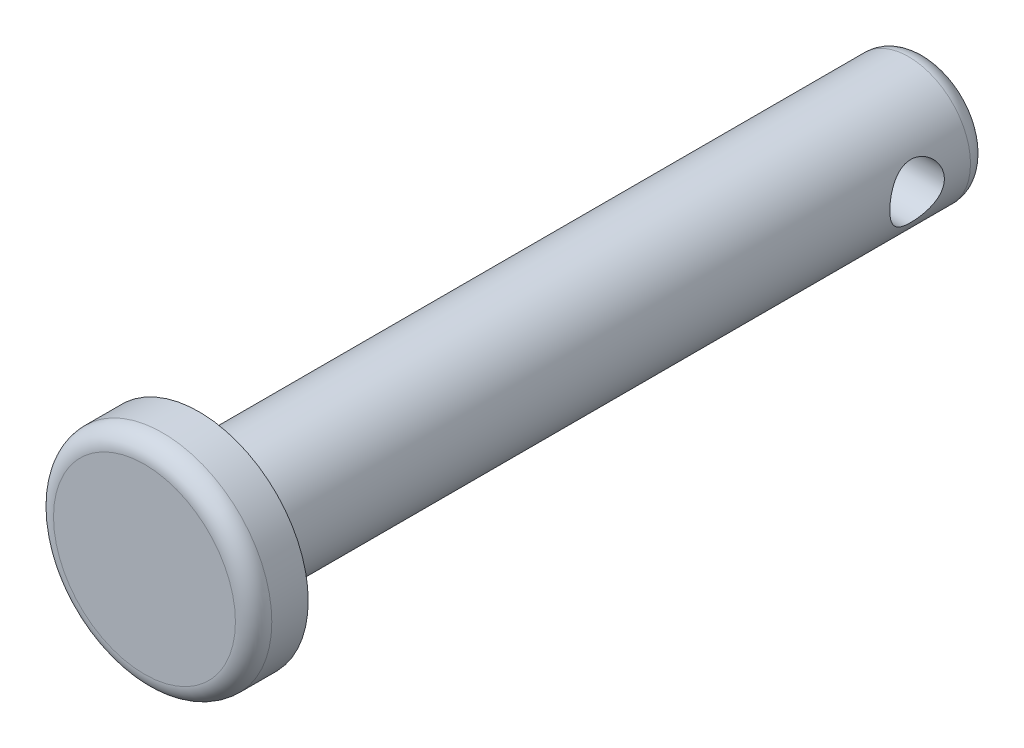
ISO-10303-21;
HEADER;
FILE_DESCRIPTION(('STEP AP214'),'2;1');
FILE_NAME('part.step','',(''),(''),'','','');
FILE_SCHEMA(('AUTOMOTIVE_DESIGN { 1 0 10303 214 1 1 1 1 }'));
ENDSEC;
DATA;
#1=APPLICATION_CONTEXT('core data for automotive mechanical design processes');
#2=APPLICATION_PROTOCOL_DEFINITION('international standard','automotive_design',2000,#1);
#3=PRODUCT_CONTEXT('',#1,'mechanical');
#4=PRODUCT('Part','Part','',(#3));
#5=PRODUCT_RELATED_PRODUCT_CATEGORY('part','',(#4));
#6=PRODUCT_DEFINITION_FORMATION('','',#4);
#7=PRODUCT_DEFINITION_CONTEXT('part definition',#1,'design');
#8=PRODUCT_DEFINITION('design','',#6,#7);
#9=PRODUCT_DEFINITION_SHAPE('','',#8);
#10=(LENGTH_UNIT() NAMED_UNIT(*) SI_UNIT(.MILLI.,.METRE.));
#11=(NAMED_UNIT(*) PLANE_ANGLE_UNIT() SI_UNIT($,.RADIAN.));
#12=(NAMED_UNIT(*) SI_UNIT($,.STERADIAN.) SOLID_ANGLE_UNIT());
#13=UNCERTAINTY_MEASURE_WITH_UNIT(LENGTH_MEASURE(1.E-05),#10,'distance_accuracy_value','');
#14=(GEOMETRIC_REPRESENTATION_CONTEXT(3) GLOBAL_UNCERTAINTY_ASSIGNED_CONTEXT((#13)) GLOBAL_UNIT_ASSIGNED_CONTEXT((#10,
#11,#12)) REPRESENTATION_CONTEXT('',''));
#15=CARTESIAN_POINT('',(0.,0.,0.));
#16=DIRECTION('',(0.,0.,1.));
#17=DIRECTION('',(1.,0.,0.));
#18=AXIS2_PLACEMENT_3D('',#15,#16,#17);
#19=CARTESIAN_POINT('',(0.,-8.76232133936268,221.521063329973));
#20=DIRECTION('',(0.,0.,1.));
#21=DIRECTION('',(1.,0.,0.));
#22=AXIS2_PLACEMENT_3D('',#19,#20,#21);
#23=CYLINDRICAL_SURFACE('',#22,17.);
#24=CARTESIAN_POINT('',(0.,-8.76232133936268,5.));
#25=DIRECTION('',(0.,0.,1.));
#26=DIRECTION('',(1.,0.,0.));
#27=AXIS2_PLACEMENT_3D('',#24,#25,#26);
#28=CIRCLE('',#27,17.);
#29=CARTESIAN_POINT('',(17.,-8.76232133936268,5.));
#30=VERTEX_POINT('',#29);
#31=EDGE_CURVE('E103',#30,#30,#28,.T.);
#32=ORIENTED_EDGE('',*,*,#31,.T.);
#33=EDGE_LOOP('',(#32));
#34=FACE_BOUND('',#33,.T.);
#35=CARTESIAN_POINT('',(0.,-8.76232133936268,200.028448312115));
#36=DIRECTION('',(0.,0.,1.));
#37=DIRECTION('',(1.,0.,0.));
#38=AXIS2_PLACEMENT_3D('',#35,#36,#37);
#39=CIRCLE('',#38,17.);
#40=CARTESIAN_POINT('',(17.,-8.76232133936268,200.028448312115));
#41=VERTEX_POINT('',#40);
#42=EDGE_CURVE('E107',#41,#41,#39,.T.);
#43=ORIENTED_EDGE('',*,*,#42,.F.);
#44=EDGE_LOOP('',(#43));
#45=FACE_BOUND('',#44,.T.);
#46=CARTESIAN_POINT('',(-17.,-8.76232133936268,27.1796390903297));
#47=CARTESIAN_POINT('',(-16.9999987618176,-8.56240971185686,27.17963760163));
#48=CARTESIAN_POINT('',(-16.9964643789322,-8.36244513842263,27.1716356781542));
#49=CARTESIAN_POINT('',(-16.9824145188103,-7.96395345314056,27.1397062777982));
#50=CARTESIAN_POINT('',(-16.9718950017991,-7.76542724035755,27.1157695852013));
#51=CARTESIAN_POINT('',(-16.9441250264791,-7.37099734679829,27.0521687131526));
#52=CARTESIAN_POINT('',(-16.9268618313529,-7.17509935844977,27.0124747705945));
#53=CARTESIAN_POINT('',(-16.8860473352039,-6.78763741091672,26.9177617280324));
#54=CARTESIAN_POINT('',(-16.8624934619151,-6.59607525949732,26.8627363585903));
#55=CARTESIAN_POINT('',(-16.8098052723294,-6.21939567596309,26.7381604841382));
#56=CARTESIAN_POINT('',(-16.7806936200709,-6.03425555943138,26.6686688703298));
#57=CARTESIAN_POINT('',(-16.7175308045529,-5.67068262419657,26.5156243049245));
#58=CARTESIAN_POINT('',(-16.6834777673438,-5.4922523825872,26.4320660168087));
#59=CARTESIAN_POINT('',(-16.611268748552,-5.14327899743994,26.2516313085886));
#60=CARTESIAN_POINT('',(-16.5731155536705,-4.97273060827862,26.1547639217918));
#61=CARTESIAN_POINT('',(-16.4935681939628,-4.64024815094122,25.9483588143517));
#62=CARTESIAN_POINT('',(-16.4521728517525,-4.47831724838952,25.8388164838507));
#63=CARTESIAN_POINT('',(-16.3202714333501,-3.99101600981834,25.4806955923257));
#64=CARTESIAN_POINT('',(-16.2257661736083,-3.68149653224687,25.2115636764044));
#65=CARTESIAN_POINT('',(-16.0357679165863,-3.11032645656515,24.626578069341));
#66=CARTESIAN_POINT('',(-15.9402743736387,-2.84870397774108,24.3106971283783));
#67=CARTESIAN_POINT('',(-15.8011827072377,-2.49013191163965,23.7974792469885));
#68=CARTESIAN_POINT('',(-15.7543279859237,-2.37366377003149,23.6143917119547));
#69=CARTESIAN_POINT('',(-15.6645887437617,-2.15668510158295,23.2381053026065));
#70=CARTESIAN_POINT('',(-15.6217025880908,-2.05616799151777,23.0449106436541));
#71=CARTESIAN_POINT('',(-15.5413433492321,-1.87198367209178,22.6496206554566));
#72=CARTESIAN_POINT('',(-15.5038690808926,-1.78831277198492,22.4475272876319));
#73=CARTESIAN_POINT('',(-15.4356802742711,-1.6386603936192,22.0357839044027));
#74=CARTESIAN_POINT('',(-15.4049651637826,-1.5726774178597,21.8261345304131));
#75=CARTESIAN_POINT('',(-15.3528822796065,-1.46214707756638,21.4119707862638));
#76=CARTESIAN_POINT('',(-15.3311111260477,-1.4166625980648,21.2077572966846));
#77=CARTESIAN_POINT('',(-15.2955268820101,-1.34285074403194,20.7955624254887));
#78=CARTESIAN_POINT('',(-15.2817135197181,-1.31452278348631,20.5875811728172));
#79=CARTESIAN_POINT('',(-15.2625890145722,-1.27540922878069,20.1697017725389));
#80=CARTESIAN_POINT('',(-15.2572731108275,-1.26461381156786,19.9598047646243));
#81=CARTESIAN_POINT('',(-15.2553422289413,-1.26068537674338,19.5398117838358));
#82=CARTESIAN_POINT('',(-15.2587267046698,-1.26755125051798,19.3297158242778));
#83=CARTESIAN_POINT('',(-15.2733790697403,-1.29746168233491,18.9296448804354));
#84=CARTESIAN_POINT('',(-15.2839249540816,-1.31902513243039,18.7395303310452));
#85=CARTESIAN_POINT('',(-15.3117899210469,-1.37651672080936,18.3619239613869));
#86=CARTESIAN_POINT('',(-15.3291113075622,-1.41244974530892,18.1744330557281));
#87=CARTESIAN_POINT('',(-15.3699767227151,-1.4982956396838,17.8034244341498));
#88=CARTESIAN_POINT('',(-15.3935194224016,-1.54820552406123,17.6199058787333));
#89=CARTESIAN_POINT('',(-15.4461324810744,-1.66155432330572,17.2578402500154));
#90=CARTESIAN_POINT('',(-15.4752049820337,-1.724998481846,17.0792951340057));
#91=CARTESIAN_POINT('',(-15.5387390782028,-1.86640062342164,16.7243786022578));
#92=CARTESIAN_POINT('',(-15.573304812122,-1.94464620471309,16.5481405707748));
#93=CARTESIAN_POINT('',(-15.6464005456784,-2.11411375606671,16.2028093316311));
#94=CARTESIAN_POINT('',(-15.684931877199,-2.20534008979867,16.0337185515176));
#95=CARTESIAN_POINT('',(-15.764957498936,-2.40015175661188,15.7035164796271));
#96=CARTESIAN_POINT('',(-15.8064522678598,-2.50373908828448,15.5424064842009));
#97=CARTESIAN_POINT('',(-15.89138829894,-2.72265560940581,15.2289093888122));
#98=CARTESIAN_POINT('',(-15.9348296834633,-2.83798553759203,15.076522838593));
#99=CARTESIAN_POINT('',(-16.0268726359395,-3.0914108516607,14.7669474822368));
#100=CARTESIAN_POINT('',(-16.0755689456753,-3.23062889467886,14.6107042057509));
#101=CARTESIAN_POINT('',(-16.1727699246668,-3.52161200415448,14.3104055582501));
#102=CARTESIAN_POINT('',(-16.2212746435545,-3.67337356261289,14.1663468022855));
#103=CARTESIAN_POINT('',(-16.3168738060765,-3.98876966087105,13.8911127410465));
#104=CARTESIAN_POINT('',(-16.363967292585,-4.15241201201704,13.7599460478464));
#105=CARTESIAN_POINT('',(-16.455469596727,-4.49053250272015,13.5115102557568));
#106=CARTESIAN_POINT('',(-16.4998794813852,-4.66500627891141,13.3942356152096));
#107=CARTESIAN_POINT('',(-16.5861192990811,-5.02913748178794,13.1711641724269));
#108=CARTESIAN_POINT('',(-16.6278356203005,-5.21908990371099,13.0658039738806));
#109=CARTESIAN_POINT('',(-16.7060159703569,-5.60821463610925,12.8716389423435));
#110=CARTESIAN_POINT('',(-16.7424822957187,-5.80738286459073,12.7828268656148));
#111=CARTESIAN_POINT('',(-16.8091112908856,-6.21357306024606,12.6226191484089));
#112=CARTESIAN_POINT('',(-16.8392756404038,-6.42059291723992,12.5512188661841));
#113=CARTESIAN_POINT('',(-16.8923989787866,-6.84093735525013,12.426617362648));
#114=CARTESIAN_POINT('',(-16.9153585910428,-7.05426138904755,12.3734145667592));
#115=CARTESIAN_POINT('',(-16.9520446758353,-7.47051154066575,12.2888907214171));
#116=CARTESIAN_POINT('',(-16.9663000182061,-7.67313603522841,12.2563105073376));
#117=CARTESIAN_POINT('',(-16.9875571747029,-8.08074925625464,12.2078537672064));
#118=CARTESIAN_POINT('',(-16.9945593219088,-8.28573787371624,12.1919764741258));
#119=CARTESIAN_POINT('',(-17.001112071305,-8.69638611542681,12.1771158012803));
#120=CARTESIAN_POINT('',(-17.0006648021213,-8.90204553120625,12.1781275955604));
#121=CARTESIAN_POINT('',(-16.9923363399864,-9.31243289094086,12.1970214263097));
#122=CARTESIAN_POINT('',(-16.9844553511811,-9.5171608603204,12.2149029994987));
#123=CARTESIAN_POINT('',(-16.9621424672984,-9.91237852124876,12.2658165814072));
#124=CARTESIAN_POINT('',(-16.9481121719674,-10.1030114423253,12.2979209354665));
#125=CARTESIAN_POINT('',(-16.9139850300567,-10.480777046056,12.3766159495761));
#126=CARTESIAN_POINT('',(-16.8938860848023,-10.6679084940097,12.4232116212154));
#127=CARTESIAN_POINT('',(-16.8481132721817,-11.0373417251316,12.5304245884089));
#128=CARTESIAN_POINT('',(-16.8224410797251,-11.2196449408845,12.5910376717126));
#129=CARTESIAN_POINT('',(-16.7661074071215,-11.5784605997218,12.725783834561));
#130=CARTESIAN_POINT('',(-16.7354440237178,-11.754970802822,12.7999220728683));
#131=CARTESIAN_POINT('',(-16.6688168250229,-12.1064996881837,12.9635976521976));
#132=CARTESIAN_POINT('',(-16.6327187173163,-12.2813045240088,13.0535393603451));
#133=CARTESIAN_POINT('',(-16.5567974568978,-12.6227701199676,13.2464898420104));
#134=CARTESIAN_POINT('',(-16.516973034582,-12.7894280746929,13.3495030734546));
#135=CARTESIAN_POINT('',(-16.434511408258,-13.1137391172709,13.5678971547437));
#136=CARTESIAN_POINT('',(-16.3918736836312,-13.2713905282802,13.6832802961971));
#137=CARTESIAN_POINT('',(-16.3047513175758,-13.5769163192091,13.9257091021107));
#138=CARTESIAN_POINT('',(-16.2602665726222,-13.7247901498908,14.0527554207729));
#139=CARTESIAN_POINT('',(-16.1668665124029,-14.0214562154228,14.3284054857871));
#140=CARTESIAN_POINT('',(-16.1178808187571,-14.1693809183453,14.4779204308751));
#141=CARTESIAN_POINT('',(-16.0202396672966,-14.4521627522488,14.788846249724));
#142=CARTESIAN_POINT('',(-15.9715841168983,-14.5870237006148,14.9502536239553));
#143=CARTESIAN_POINT('',(-15.8758856629276,-14.843023995901,15.2842598264777));
#144=CARTESIAN_POINT('',(-15.8288439616718,-14.9641532611613,15.4568667330247));
#145=CARTESIAN_POINT('',(-15.7377848634208,-15.1917183608951,15.8121669896642));
#146=CARTESIAN_POINT('',(-15.6937662177618,-15.2981602804897,15.994856118401));
#147=CARTESIAN_POINT('',(-15.6091213139959,-15.4978515255942,16.3736578199828));
#148=CARTESIAN_POINT('',(-15.5685957142447,-15.5907432927787,16.5699818816967));
#149=CARTESIAN_POINT('',(-15.4935099829238,-15.7594405928046,16.9708420065442));
#150=CARTESIAN_POINT('',(-15.4589470607763,-15.8352541234961,17.1753741726755));
#151=CARTESIAN_POINT('',(-15.3970618393825,-15.9689794017956,17.5911613335102));
#152=CARTESIAN_POINT('',(-15.3697355241645,-16.0269010815109,17.8024125262529));
#153=CARTESIAN_POINT('',(-15.3233870131806,-16.1241638841715,18.2300396765538));
#154=CARTESIAN_POINT('',(-15.304363898563,-16.1635070630969,18.4464150642614));
#155=CARTESIAN_POINT('',(-15.2766303243879,-16.2205703762689,18.8640737171996));
#156=CARTESIAN_POINT('',(-15.2671883378055,-16.2398281672299,19.065099494763));
#157=CARTESIAN_POINT('',(-15.2562803097145,-16.2620593091183,19.4682620599822));
#158=CARTESIAN_POINT('',(-15.2548138026093,-16.2650336106512,19.6703987820929));
#159=CARTESIAN_POINT('',(-15.2599105688193,-16.2546614700008,20.0741110997415));
#160=CARTESIAN_POINT('',(-15.2664723922208,-16.2413179748061,20.2756867900125));
#161=CARTESIAN_POINT('',(-15.2873817125524,-16.1984847551424,20.6767017592205));
#162=CARTESIAN_POINT('',(-15.3017290956991,-16.1689952666418,20.8761410693365));
#163=CARTESIAN_POINT('',(-15.3366356066417,-16.096428111515,21.2597398738948));
#164=CARTESIAN_POINT('',(-15.3567802825464,-16.0542505157398,21.444108689553));
#165=CARTESIAN_POINT('',(-15.4029037744693,-15.9563107296066,21.8085180865572));
#166=CARTESIAN_POINT('',(-15.4288845894815,-15.9005438841035,21.9885571614336));
#167=CARTESIAN_POINT('',(-15.4859239930874,-15.7759400294965,22.3431841577405));
#168=CARTESIAN_POINT('',(-15.5169818091017,-15.7071050087511,22.5177729037537));
#169=CARTESIAN_POINT('',(-15.5833497316703,-15.5568745555224,22.8606930920044));
#170=CARTESIAN_POINT('',(-15.6186614708483,-15.4754742972015,23.0290220991573));
#171=CARTESIAN_POINT('',(-15.6949761757838,-15.2951539257605,23.3690064223014));
#172=CARTESIAN_POINT('',(-15.7361979307845,-15.1954508207674,23.5401974513749));
#173=CARTESIAN_POINT('',(-15.8213316052105,-14.983137076182,23.8737483463654));
#174=CARTESIAN_POINT('',(-15.8652444478091,-14.8705219954878,24.036105145246));
#175=CARTESIAN_POINT('',(-15.9546415380316,-14.6330545192624,24.3511929818659));
#176=CARTESIAN_POINT('',(-16.0001260630447,-14.5081999563452,24.5039223068614));
#177=CARTESIAN_POINT('',(-16.0915583277215,-14.2469277058765,24.7990074684539));
#178=CARTESIAN_POINT('',(-16.137506093603,-14.1105093605795,24.9413627141179));
#179=CARTESIAN_POINT('',(-16.2327119858732,-13.8145729381715,25.2267610139672));
#180=CARTESIAN_POINT('',(-16.2819150840968,-13.6540772255193,25.3688109329505));
#181=CARTESIAN_POINT('',(-16.3782380815521,-13.321194808037,25.6388836551942));
#182=CARTESIAN_POINT('',(-16.4253586554878,-13.1488120014666,25.7669110217031));
#183=CARTESIAN_POINT('',(-16.516295806945,-12.7929205196823,26.0081876560535));
#184=CARTESIAN_POINT('',(-16.5601093130035,-12.6094017803859,26.1214232555334));
#185=CARTESIAN_POINT('',(-16.6431528141468,-12.2325753947149,26.3319992607599));
#186=CARTESIAN_POINT('',(-16.6823849259784,-12.0392723286556,26.429347015518));
#187=CARTESIAN_POINT('',(-16.7547559852408,-11.6463453640827,26.6062754554005));
#188=CARTESIAN_POINT('',(-16.7879598751984,-11.4468198430959,26.686047765827));
#189=CARTESIAN_POINT('',(-16.8478572625947,-11.0408668104231,26.8283776950041));
#190=CARTESIAN_POINT('',(-16.8745538879421,-10.834442669238,26.89094358639));
#191=CARTESIAN_POINT('',(-16.9206100593308,-10.4167123207193,26.9980663961286));
#192=CARTESIAN_POINT('',(-16.9399872060172,-10.2054191379157,27.0426665328786));
#193=CARTESIAN_POINT('',(-16.9708951536721,-9.77931655953298,27.1135012668607));
#194=CARTESIAN_POINT('',(-16.9824314424215,-9.56450973119312,27.1397487094309));
#195=CARTESIAN_POINT('',(-16.9932452733323,-9.25136715281903,27.1643181002558));
#196=CARTESIAN_POINT('',(-16.9957763541779,-9.1536691436887,27.1700613115917));
#197=CARTESIAN_POINT('',(-16.99915402945,-8.95809210256494,27.1777221910687));
#198=CARTESIAN_POINT('',(-17.000000606307,-8.86021306869408,27.1796398193087));
#199=CARTESIAN_POINT('',(-17.,-8.76232133936268,27.1796390903297));
#200=B_SPLINE_CURVE_WITH_KNOTS('',3,(#46,#47,#48,#49,#50,#51,#52,#53,#54,#55,#56,#57,#58,#59,
#60,#61,#62,#63,#64,#65,#66,#67,#68,#69,#70,#71,#72,#73,#74,#75,#76,#77,#78,#79,#80,#81,#82,#83,
#84,#85,#86,#87,#88,#89,#90,#91,#92,#93,#94,#95,#96,#97,#98,#99,#100,#101,#102,#103,#104,#105,
#106,#107,#108,#109,#110,#111,#112,#113,#114,#115,#116,#117,#118,#119,#120,#121,#122,#123,#124,
#125,#126,#127,#128,#129,#130,#131,#132,#133,#134,#135,#136,#137,#138,#139,#140,#141,#142,#143,
#144,#145,#146,#147,#148,#149,#150,#151,#152,#153,#154,#155,#156,#157,#158,#159,#160,#161,#162,
#163,#164,#165,#166,#167,#168,#169,#170,#171,#172,#173,#174,#175,#176,#177,#178,#179,#180,#181,
#182,#183,#184,#185,#186,#187,#188,#189,#190,#191,#192,#193,#194,#195,#196,#197,#198,#199),
.UNSPECIFIED.,.T.,.F.,(4,2,2,2,2,2,2,2,2,2,2,2,2,2,2,2,2,2,2,2,2,2,2,2,2,2,2,2,2,2,2,2,2,2,2,2,
2,2,2,2,2,2,2,2,2,2,2,2,2,2,2,2,2,2,2,2,2,2,2,2,2,2,2,2,2,2,2,2,2,2,2,2,2,2,2,2,4),(0.,
0.599636456311775,1.1996200080942,1.80074227363133,2.40211071612494,3.00107729130736,
3.60027161253652,4.19906123235333,4.79806931965401,6.05504633830563,7.31275895085912,
7.97803071391266,8.6430271914243,9.30787781950188,9.97267214199558,10.6028569532459,
11.2330202380911,11.862830335992,12.4926009011598,13.0667990228903,13.64119256064,
14.2154634997226,14.7899573377917,15.3770411075671,15.9643227024523,16.5516993811115,
17.1391130350331,17.782970055371,18.4266476159258,19.0707522804463,19.7145991346715,
20.3772975045792,21.0397051013516,21.7019359157445,22.3641094146563,22.9804734225658,
23.5968091246684,24.2129687155702,24.8291113859064,25.4099195533493,25.9909288077289,
26.5717636944206,27.1528205880239,27.7517957783625,28.350975795645,28.9502670074693,
29.5495918548434,30.1967204690094,30.8436594104036,31.491070292951,32.1382121358005,
32.8001602266109,33.4617976753462,34.1230671737237,34.7842634758997,35.3899665602462,
35.9956342841789,36.6011926408724,37.2067421477633,37.7767163109514,38.3468860001462,
38.9169690058957,39.4872715064596,40.0936857737929,40.7003092478959,41.3070403385248,
41.9138059630772,42.5727388279265,43.2314566203253,43.8907788600928,44.5497952569863,
45.2012254001273,45.8523417939055,46.5018823722515,47.1509678706571,47.4445917993021,
47.7382187904425),.UNSPECIFIED.);
#201=CARTESIAN_POINT('',(-17.,-8.76232133936268,27.1796390903297));
#202=VERTEX_POINT('',#201);
#203=EDGE_CURVE('E64',#202,#202,#200,.T.);
#204=ORIENTED_EDGE('',*,*,#203,.F.);
#205=EDGE_LOOP('',(#204));
#206=FACE_BOUND('',#205,.T.);
#207=CARTESIAN_POINT('',(17.,-8.76232133936268,12.1796390903297));
#208=CARTESIAN_POINT('',(16.9999987618176,-8.56240971185686,12.1796405790294));
#209=CARTESIAN_POINT('',(16.9964643789322,-8.36244513842263,12.1876425025052));
#210=CARTESIAN_POINT('',(16.9824145188103,-7.96395345314056,12.2195719028611));
#211=CARTESIAN_POINT('',(16.9718950017991,-7.76542724035755,12.2435085954581));
#212=CARTESIAN_POINT('',(16.9441250264791,-7.37099734679829,12.3071094675068));
#213=CARTESIAN_POINT('',(16.9268618313529,-7.17509935844977,12.3468034100648));
#214=CARTESIAN_POINT('',(16.8860473352039,-6.78763741091672,12.4415164526269));
#215=CARTESIAN_POINT('',(16.8624934619151,-6.59607525949732,12.4965418220691));
#216=CARTESIAN_POINT('',(16.8098052723294,-6.21939567596309,12.6211176965212));
#217=CARTESIAN_POINT('',(16.7806936200709,-6.03425555943139,12.6906093103295));
#218=CARTESIAN_POINT('',(16.7175308045529,-5.67068262419657,12.8436538757349));
#219=CARTESIAN_POINT('',(16.6834777673438,-5.4922523825872,12.9272121638507));
#220=CARTESIAN_POINT('',(16.611268748552,-5.14327899743994,13.1076468720708));
#221=CARTESIAN_POINT('',(16.5731155536705,-4.97273060827862,13.2045142588675));
#222=CARTESIAN_POINT('',(16.4935681939628,-4.64024815094122,13.4109193663077));
#223=CARTESIAN_POINT('',(16.4521728517525,-4.47831724838952,13.5204616968087));
#224=CARTESIAN_POINT('',(16.3202714333501,-3.99101600981834,13.8785825883337));
#225=CARTESIAN_POINT('',(16.2257661736083,-3.68149653224687,14.1477145042549));
#226=CARTESIAN_POINT('',(16.0357679165863,-3.11032645656514,14.7327001113184));
#227=CARTESIAN_POINT('',(15.9402743736387,-2.84870397774108,15.0485810522811));
#228=CARTESIAN_POINT('',(15.8011827072378,-2.49013191163964,15.5617989336708));
#229=CARTESIAN_POINT('',(15.7543279859237,-2.37366377003149,15.7448864687047));
#230=CARTESIAN_POINT('',(15.6645887437617,-2.15668510158295,16.1211728780529));
#231=CARTESIAN_POINT('',(15.6217025880908,-2.05616799151777,16.3143675370053));
#232=CARTESIAN_POINT('',(15.5413433492321,-1.87198367209178,16.7096575252028));
#233=CARTESIAN_POINT('',(15.5038690808926,-1.78831277198492,16.9117508930275));
#234=CARTESIAN_POINT('',(15.4356802742711,-1.6386603936192,17.3234942762567));
#235=CARTESIAN_POINT('',(15.4049651637826,-1.5726774178597,17.5331436502463));
#236=CARTESIAN_POINT('',(15.3528822796065,-1.46214707756639,17.9473073943955));
#237=CARTESIAN_POINT('',(15.3311111260477,-1.4166625980648,18.1515208839747));
#238=CARTESIAN_POINT('',(15.2955268820101,-1.34285074403194,18.5637157551707));
#239=CARTESIAN_POINT('',(15.2817135197181,-1.31452278348631,18.7716970078421));
#240=CARTESIAN_POINT('',(15.2625890145722,-1.27540922878069,19.1895764081205));
#241=CARTESIAN_POINT('',(15.2572731108275,-1.26461381156786,19.3994734160351));
#242=CARTESIAN_POINT('',(15.2553422289413,-1.26068537674338,19.8194663968236));
#243=CARTESIAN_POINT('',(15.2587267046698,-1.26755125051798,20.0295623563816));
#244=CARTESIAN_POINT('',(15.2733790697403,-1.29746168233491,20.429633300224));
#245=CARTESIAN_POINT('',(15.2839249540816,-1.31902513243039,20.6197478496141));
#246=CARTESIAN_POINT('',(15.3117899210469,-1.37651672080936,20.9973542192724));
#247=CARTESIAN_POINT('',(15.3291113075622,-1.41244974530892,21.1848451249312));
#248=CARTESIAN_POINT('',(15.3699767227151,-1.4982956396838,21.5558537465096));
#249=CARTESIAN_POINT('',(15.3935194224016,-1.54820552406123,21.7393723019261));
#250=CARTESIAN_POINT('',(15.4461324810744,-1.66155432330572,22.101437930644));
#251=CARTESIAN_POINT('',(15.4752049820337,-1.724998481846,22.2799830466537));
#252=CARTESIAN_POINT('',(15.5387390782028,-1.86640062342164,22.6348995784016));
#253=CARTESIAN_POINT('',(15.573304812122,-1.94464620471309,22.8111376098846));
#254=CARTESIAN_POINT('',(15.6464005456784,-2.11411375606671,23.1564688490283));
#255=CARTESIAN_POINT('',(15.684931877199,-2.20534008979867,23.3255596291418));
#256=CARTESIAN_POINT('',(15.764957498936,-2.40015175661189,23.6557617010323));
#257=CARTESIAN_POINT('',(15.8064522678598,-2.50373908828448,23.8168716964585));
#258=CARTESIAN_POINT('',(15.89138829894,-2.72265560940581,24.1303687918472));
#259=CARTESIAN_POINT('',(15.9348296834633,-2.83798553759203,24.2827553420664));
#260=CARTESIAN_POINT('',(16.0268726359395,-3.0914108516607,24.5923306984226));
#261=CARTESIAN_POINT('',(16.0755689456753,-3.23062889467886,24.7485739749084));
#262=CARTESIAN_POINT('',(16.1727699246668,-3.52161200415448,25.0488726224092));
#263=CARTESIAN_POINT('',(16.2212746435545,-3.67337356261289,25.1929313783738));
#264=CARTESIAN_POINT('',(16.3168738060765,-3.98876966087105,25.4681654396129));
#265=CARTESIAN_POINT('',(16.363967292585,-4.15241201201704,25.599332132813));
#266=CARTESIAN_POINT('',(16.455469596727,-4.49053250272016,25.8477679249026));
#267=CARTESIAN_POINT('',(16.4998794813852,-4.66500627891141,25.9650425654498));
#268=CARTESIAN_POINT('',(16.5861192990811,-5.02913748178794,26.1881140082325));
#269=CARTESIAN_POINT('',(16.6278356203005,-5.21908990371099,26.2934742067788));
#270=CARTESIAN_POINT('',(16.7060159703569,-5.60821463610925,26.4876392383158));
#271=CARTESIAN_POINT('',(16.7424822957187,-5.80738286459073,26.5764513150446));
#272=CARTESIAN_POINT('',(16.8091112908856,-6.21357306024606,26.7366590322504));
#273=CARTESIAN_POINT('',(16.8392756404038,-6.42059291723992,26.8080593144753));
#274=CARTESIAN_POINT('',(16.8923989787866,-6.84093735525013,26.9326608180114));
#275=CARTESIAN_POINT('',(16.9153585910428,-7.05426138904755,26.9858636139002));
#276=CARTESIAN_POINT('',(16.9520446758353,-7.47051154066575,27.0703874592423));
#277=CARTESIAN_POINT('',(16.9663000182061,-7.67313603522841,27.1029676733218));
#278=CARTESIAN_POINT('',(16.9875571747029,-8.08074925625463,27.151424413453));
#279=CARTESIAN_POINT('',(16.9945593219088,-8.28573787371623,27.1673017065336));
#280=CARTESIAN_POINT('',(17.001112071305,-8.69638611542681,27.1821623793791));
#281=CARTESIAN_POINT('',(17.0006648021213,-8.90204553120625,27.181150585099));
#282=CARTESIAN_POINT('',(16.9923363399864,-9.31243289094086,27.1622567543497));
#283=CARTESIAN_POINT('',(16.9844553511811,-9.5171608603204,27.1443751811607));
#284=CARTESIAN_POINT('',(16.9621424672984,-9.91237852124876,27.0934615992522));
#285=CARTESIAN_POINT('',(16.9481121719674,-10.1030114423253,27.0613572451929));
#286=CARTESIAN_POINT('',(16.9139850300567,-10.480777046056,26.9826622310832));
#287=CARTESIAN_POINT('',(16.8938860848023,-10.6679084940097,26.9360665594439));
#288=CARTESIAN_POINT('',(16.8481132721817,-11.0373417251316,26.8288535922505));
#289=CARTESIAN_POINT('',(16.8224410797251,-11.2196449408845,26.7682405089468));
#290=CARTESIAN_POINT('',(16.7661074071215,-11.5784605997218,26.6334943460984));
#291=CARTESIAN_POINT('',(16.7354440237178,-11.754970802822,26.5593561077911));
#292=CARTESIAN_POINT('',(16.6688168250229,-12.1064996881837,26.3956805284618));
#293=CARTESIAN_POINT('',(16.6327187173163,-12.2813045240088,26.3057388203143));
#294=CARTESIAN_POINT('',(16.5567974568978,-12.6227701199676,26.112788338649));
#295=CARTESIAN_POINT('',(16.516973034582,-12.7894280746929,26.0097751072048));
#296=CARTESIAN_POINT('',(16.434511408258,-13.1137391172709,25.7913810259157));
#297=CARTESIAN_POINT('',(16.3918736836312,-13.2713905282802,25.6759978844623));
#298=CARTESIAN_POINT('',(16.3047513175758,-13.5769163192091,25.4335690785487));
#299=CARTESIAN_POINT('',(16.2602665726222,-13.7247901498908,25.3065227598865));
#300=CARTESIAN_POINT('',(16.1668665124029,-14.0214562154228,25.0308726948722));
#301=CARTESIAN_POINT('',(16.1178808187571,-14.1693809183453,24.8813577497843));
#302=CARTESIAN_POINT('',(16.0202396672966,-14.4521627522488,24.5704319309354));
#303=CARTESIAN_POINT('',(15.9715841168983,-14.5870237006148,24.4090245567041));
#304=CARTESIAN_POINT('',(15.8758856629276,-14.843023995901,24.0750183541817));
#305=CARTESIAN_POINT('',(15.8288439616718,-14.9641532611613,23.9024114476347));
#306=CARTESIAN_POINT('',(15.7377848634208,-15.1917183608951,23.5471111909951));
#307=CARTESIAN_POINT('',(15.6937662177618,-15.2981602804897,23.3644220622584));
#308=CARTESIAN_POINT('',(15.6091213139959,-15.4978515255942,22.9856203606766));
#309=CARTESIAN_POINT('',(15.5685957142447,-15.5907432927787,22.7892962989627));
#310=CARTESIAN_POINT('',(15.4935099829238,-15.7594405928046,22.3884361741152));
#311=CARTESIAN_POINT('',(15.4589470607763,-15.8352541234961,22.1839040079839));
#312=CARTESIAN_POINT('',(15.3970618393825,-15.9689794017956,21.7681168471492));
#313=CARTESIAN_POINT('',(15.3697355241645,-16.0269010815109,21.5568656544065));
#314=CARTESIAN_POINT('',(15.3233870131806,-16.1241638841715,21.1292385041055));
#315=CARTESIAN_POINT('',(15.304363898563,-16.1635070630969,20.912863116398));
#316=CARTESIAN_POINT('',(15.2766303243879,-16.2205703762689,20.4952044634598));
#317=CARTESIAN_POINT('',(15.2671883378055,-16.2398281672299,20.2941786858963));
#318=CARTESIAN_POINT('',(15.2562803097145,-16.2620593091183,19.8910161206772));
#319=CARTESIAN_POINT('',(15.2548138026093,-16.2650336106512,19.6888793985664));
#320=CARTESIAN_POINT('',(15.2599105688193,-16.2546614700008,19.2851670809179));
#321=CARTESIAN_POINT('',(15.2664723922208,-16.2413179748061,19.0835913906468));
#322=CARTESIAN_POINT('',(15.2873817125524,-16.1984847551424,18.6825764214388));
#323=CARTESIAN_POINT('',(15.3017290956991,-16.1689952666418,18.4831371113228));
#324=CARTESIAN_POINT('',(15.3366356066417,-16.096428111515,18.0995383067646));
#325=CARTESIAN_POINT('',(15.3567802825464,-16.0542505157398,17.9151694911064));
#326=CARTESIAN_POINT('',(15.4029037744693,-15.9563107296066,17.5507600941022));
#327=CARTESIAN_POINT('',(15.4288845894815,-15.9005438841035,17.3707210192258));
#328=CARTESIAN_POINT('',(15.4859239930874,-15.7759400294965,17.0160940229189));
#329=CARTESIAN_POINT('',(15.5169818091017,-15.7071050087511,16.8415052769057));
#330=CARTESIAN_POINT('',(15.5833497316703,-15.5568745555224,16.498585088655));
#331=CARTESIAN_POINT('',(15.6186614708483,-15.4754742972015,16.3302560815021));
#332=CARTESIAN_POINT('',(15.6949761757838,-15.2951539257605,15.990271758358));
#333=CARTESIAN_POINT('',(15.7361979307845,-15.1954508207674,15.8190807292845));
#334=CARTESIAN_POINT('',(15.8213316052105,-14.983137076182,15.485529834294));
#335=CARTESIAN_POINT('',(15.8652444478091,-14.8705219954878,15.3231730354134));
#336=CARTESIAN_POINT('',(15.9546415380316,-14.6330545192624,15.0080851987934));
#337=CARTESIAN_POINT('',(16.0001260630447,-14.5081999563452,14.8553558737979));
#338=CARTESIAN_POINT('',(16.0915583277215,-14.2469277058765,14.5602707122054));
#339=CARTESIAN_POINT('',(16.137506093603,-14.1105093605796,14.4179154665415));
#340=CARTESIAN_POINT('',(16.2327119858732,-13.8145729381715,14.1325171666922));
#341=CARTESIAN_POINT('',(16.2819150840968,-13.6540772255193,13.9904672477089));
#342=CARTESIAN_POINT('',(16.3782380815521,-13.321194808037,13.7203945254652));
#343=CARTESIAN_POINT('',(16.4253586554878,-13.1488120014666,13.5923671589563));
#344=CARTESIAN_POINT('',(16.516295806945,-12.7929205196823,13.3510905246059));
#345=CARTESIAN_POINT('',(16.5601093130035,-12.6094017803859,13.237854925126));
#346=CARTESIAN_POINT('',(16.6431528141468,-12.2325753947149,13.0272789198995));
#347=CARTESIAN_POINT('',(16.6823849259784,-12.0392723286556,12.9299311651414));
#348=CARTESIAN_POINT('',(16.7547559852408,-11.6463453640827,12.7530027252589));
#349=CARTESIAN_POINT('',(16.7879598751984,-11.4468198430959,12.6732304148323));
#350=CARTESIAN_POINT('',(16.8478572625947,-11.0408668104231,12.5309004856552));
#351=CARTESIAN_POINT('',(16.8745538879421,-10.834442669238,12.4683345942693));
#352=CARTESIAN_POINT('',(16.9206100593308,-10.4167123207193,12.3612117845308));
#353=CARTESIAN_POINT('',(16.9399872060172,-10.2054191379157,12.3166116477807));
#354=CARTESIAN_POINT('',(16.9708951536721,-9.77931655953298,12.2457769137987));
#355=CARTESIAN_POINT('',(16.9824314424215,-9.56450973119312,12.2195294712284));
#356=CARTESIAN_POINT('',(16.9932452733323,-9.25136715281903,12.1949600804036));
#357=CARTESIAN_POINT('',(16.9957763541779,-9.1536691436887,12.1892168690677));
#358=CARTESIAN_POINT('',(16.99915402945,-8.95809210256494,12.1815559895907));
#359=CARTESIAN_POINT('',(17.000000606307,-8.86021306869408,12.1796383613506));
#360=CARTESIAN_POINT('',(17.,-8.76232133936268,12.1796390903297));
#361=B_SPLINE_CURVE_WITH_KNOTS('',3,(#207,#208,#209,#210,#211,#212,#213,#214,#215,#216,#217,
#218,#219,#220,#221,#222,#223,#224,#225,#226,#227,#228,#229,#230,#231,#232,#233,#234,#235,#236,
#237,#238,#239,#240,#241,#242,#243,#244,#245,#246,#247,#248,#249,#250,#251,#252,#253,#254,#255,
#256,#257,#258,#259,#260,#261,#262,#263,#264,#265,#266,#267,#268,#269,#270,#271,#272,#273,#274,
#275,#276,#277,#278,#279,#280,#281,#282,#283,#284,#285,#286,#287,#288,#289,#290,#291,#292,#293,
#294,#295,#296,#297,#298,#299,#300,#301,#302,#303,#304,#305,#306,#307,#308,#309,#310,#311,#312,
#313,#314,#315,#316,#317,#318,#319,#320,#321,#322,#323,#324,#325,#326,#327,#328,#329,#330,#331,
#332,#333,#334,#335,#336,#337,#338,#339,#340,#341,#342,#343,#344,#345,#346,#347,#348,#349,#350,
#351,#352,#353,#354,#355,#356,#357,#358,#359,#360),.UNSPECIFIED.,.T.,.F.,(4,2,2,2,2,2,2,2,2,2,2,
2,2,2,2,2,2,2,2,2,2,2,2,2,2,2,2,2,2,2,2,2,2,2,2,2,2,2,2,2,2,2,2,2,2,2,2,2,2,2,2,2,2,2,2,2,2,2,2,
2,2,2,2,2,2,2,2,2,2,2,2,2,2,2,2,2,4),(0.,0.599636456311775,1.1996200080942,1.80074227363133,
2.40211071612494,3.00107729130736,3.60027161253652,4.19906123235333,4.79806931965401,
6.05504633830563,7.31275895085912,7.97803071391267,8.6430271914243,9.30787781950188,
9.97267214199558,10.6028569532459,11.2330202380911,11.862830335992,12.4926009011598,
13.0667990228903,13.64119256064,14.2154634997226,14.7899573377917,15.3770411075671,
15.9643227024523,16.5516993811115,17.1391130350331,17.782970055371,18.4266476159258,
19.0707522804463,19.7145991346715,20.3772975045792,21.0397051013515,21.7019359157445,
22.3641094146563,22.9804734225658,23.5968091246684,24.2129687155702,24.8291113859064,
25.4099195533493,25.9909288077289,26.5717636944206,27.1528205880239,27.7517957783625,
28.350975795645,28.9502670074693,29.5495918548434,30.1967204690094,30.8436594104036,
31.491070292951,32.1382121358005,32.8001602266109,33.4617976753462,34.1230671737237,
34.7842634758997,35.3899665602462,35.9956342841789,36.6011926408724,37.2067421477633,
37.7767163109514,38.3468860001462,38.9169690058957,39.4872715064596,40.0936857737929,
40.7003092478959,41.3070403385248,41.9138059630772,42.5727388279265,43.2314566203253,
43.8907788600928,44.5497952569863,45.2012254001273,45.8523417939055,46.5018823722515,
47.1509678706572,47.4445917993021,47.7382187904425),.UNSPECIFIED.);
#362=CARTESIAN_POINT('',(17.,-8.76232133936268,12.1796390903297));
#363=VERTEX_POINT('',#362);
#364=EDGE_CURVE('E45',#363,#363,#361,.T.);
#365=ORIENTED_EDGE('',*,*,#364,.F.);
#366=EDGE_LOOP('',(#365));
#367=FACE_BOUND('',#366,.T.);
#368=ADVANCED_FACE('F41',(#34,#45,#206,#367),#23,.T.);
#369=CARTESIAN_POINT('',(0.,0.,215.028448312115));
#370=DIRECTION('',(0.,0.,-1.));
#371=DIRECTION('',(-1.,0.,0.));
#372=AXIS2_PLACEMENT_3D('',#369,#370,#371);
#373=PLANE('',#372);
#374=CARTESIAN_POINT('',(0.,-8.76232133936268,215.028448312115));
#375=DIRECTION('',(0.,0.,-1.));
#376=DIRECTION('',(-1.,0.,0.));
#377=AXIS2_PLACEMENT_3D('',#374,#375,#376);
#378=CIRCLE('',#377,25.);
#379=CARTESIAN_POINT('',(-25.,-8.76232133936268,215.028448312115));
#380=VERTEX_POINT('',#379);
#381=EDGE_CURVE('E54',#380,#380,#378,.F.);
#382=ORIENTED_EDGE('',*,*,#381,.T.);
#383=EDGE_LOOP('',(#382));
#384=FACE_BOUND('',#383,.T.);
#385=ADVANCED_FACE('F88',(#384),#373,.F.);
#386=CARTESIAN_POINT('',(0.,0.,0.));
#387=DIRECTION('',(0.,0.,1.));
#388=DIRECTION('',(1.,0.,0.));
#389=AXIS2_PLACEMENT_3D('',#386,#387,#388);
#390=PLANE('',#389);
#391=CARTESIAN_POINT('',(0.,-8.76232133936268,0.));
#392=DIRECTION('',(0.,0.,1.));
#393=DIRECTION('',(1.,0.,0.));
#394=AXIS2_PLACEMENT_3D('',#391,#392,#393);
#395=CIRCLE('',#394,12.);
#396=CARTESIAN_POINT('',(12.,-8.76232133936268,0.));
#397=VERTEX_POINT('',#396);
#398=EDGE_CURVE('E61',#397,#397,#395,.F.);
#399=ORIENTED_EDGE('',*,*,#398,.T.);
#400=EDGE_LOOP('',(#399));
#401=FACE_BOUND('',#400,.T.);
#402=ADVANCED_FACE('F83',(#401),#390,.F.);
#403=CARTESIAN_POINT('',(0.,0.,200.028448312115));
#404=DIRECTION('',(0.,0.,1.));
#405=DIRECTION('',(1.,0.,0.));
#406=AXIS2_PLACEMENT_3D('',#403,#404,#405);
#407=PLANE('',#406);
#408=CARTESIAN_POINT('',(0.,-8.76232133936268,200.028448312115));
#409=DIRECTION('',(0.,0.,1.));
#410=DIRECTION('',(1.,0.,0.));
#411=AXIS2_PLACEMENT_3D('',#408,#409,#410);
#412=CIRCLE('',#411,30.);
#413=CARTESIAN_POINT('',(30.,-8.76232133936268,200.028448312115));
#414=VERTEX_POINT('',#413);
#415=EDGE_CURVE('E114',#414,#414,#412,.T.);
#416=ORIENTED_EDGE('',*,*,#415,.F.);
#417=EDGE_LOOP('',(#416));
#418=FACE_BOUND('',#417,.T.);
#419=ORIENTED_EDGE('',*,*,#42,.T.);
#420=EDGE_LOOP('',(#419));
#421=FACE_BOUND('',#420,.T.);
#422=ADVANCED_FACE('F81',(#418,#421),#407,.F.);
#423=CARTESIAN_POINT('',(0.,-8.76232133936268,221.521063329973));
#424=DIRECTION('',(0.,0.,1.));
#425=DIRECTION('',(1.,0.,0.));
#426=AXIS2_PLACEMENT_3D('',#423,#424,#425);
#427=CYLINDRICAL_SURFACE('',#426,30.);
#428=CARTESIAN_POINT('',(0.,-8.76232133936268,210.028448312115));
#429=DIRECTION('',(0.,0.,-1.));
#430=DIRECTION('',(-1.,0.,0.));
#431=AXIS2_PLACEMENT_3D('',#428,#429,#430);
#432=CIRCLE('',#431,30.);
#433=CARTESIAN_POINT('',(-30.,-8.76232133936268,210.028448312115));
#434=VERTEX_POINT('',#433);
#435=EDGE_CURVE('E10',#434,#434,#432,.T.);
#436=ORIENTED_EDGE('',*,*,#435,.T.);
#437=EDGE_LOOP('',(#436));
#438=FACE_BOUND('',#437,.T.);
#439=ORIENTED_EDGE('',*,*,#415,.T.);
#440=EDGE_LOOP('',(#439));
#441=FACE_BOUND('',#440,.T.);
#442=ADVANCED_FACE('F77',(#438,#441),#427,.T.);
#443=CARTESIAN_POINT('',(0.,-8.76232133936268,5.));
#444=DIRECTION('',(0.,0.,1.));
#445=DIRECTION('',(1.,0.,0.));
#446=AXIS2_PLACEMENT_3D('',#443,#444,#445);
#447=TOROIDAL_SURFACE('',#446,12.,5.);
#448=ORIENTED_EDGE('',*,*,#398,.F.);
#449=EDGE_LOOP('',(#448));
#450=FACE_BOUND('',#449,.T.);
#451=ORIENTED_EDGE('',*,*,#31,.F.);
#452=EDGE_LOOP('',(#451));
#453=FACE_BOUND('',#452,.T.);
#454=ADVANCED_FACE('F80',(#450,#453),#447,.T.);
#455=CARTESIAN_POINT('',(0.,-8.76232133936268,210.028448312115));
#456=DIRECTION('',(0.,0.,-1.));
#457=DIRECTION('',(-1.,0.,0.));
#458=AXIS2_PLACEMENT_3D('',#455,#456,#457);
#459=TOROIDAL_SURFACE('',#458,25.,5.);
#460=ORIENTED_EDGE('',*,*,#435,.F.);
#461=EDGE_LOOP('',(#460));
#462=FACE_BOUND('',#461,.T.);
#463=ORIENTED_EDGE('',*,*,#381,.F.);
#464=EDGE_LOOP('',(#463));
#465=FACE_BOUND('',#464,.T.);
#466=ADVANCED_FACE('F43',(#462,#465),#459,.T.);
#467=CARTESIAN_POINT('',(20.,-8.76232133936268,19.6796390903297));
#468=DIRECTION('',(-1.,0.,0.));
#469=DIRECTION('',(0.,0.,1.));
#470=AXIS2_PLACEMENT_3D('',#467,#468,#469);
#471=CYLINDRICAL_SURFACE('',#470,7.5);
#472=ORIENTED_EDGE('',*,*,#203,.T.);
#473=EDGE_LOOP('',(#472));
#474=FACE_BOUND('',#473,.T.);
#475=ORIENTED_EDGE('',*,*,#364,.T.);
#476=EDGE_LOOP('',(#475));
#477=FACE_BOUND('',#476,.T.);
#478=ADVANCED_FACE('F72',(#474,#477),#471,.F.);
#479=CLOSED_SHELL('',(#368,#385,#402,#422,#442,#454,#466,#478));
#480=MANIFOLD_SOLID_BREP('B2',#479);
#481=ADVANCED_BREP_SHAPE_REPRESENTATION('',(#18,#480),#14);
#482=SHAPE_DEFINITION_REPRESENTATION(#9,#481);
ENDSEC;
END-ISO-10303-21;
